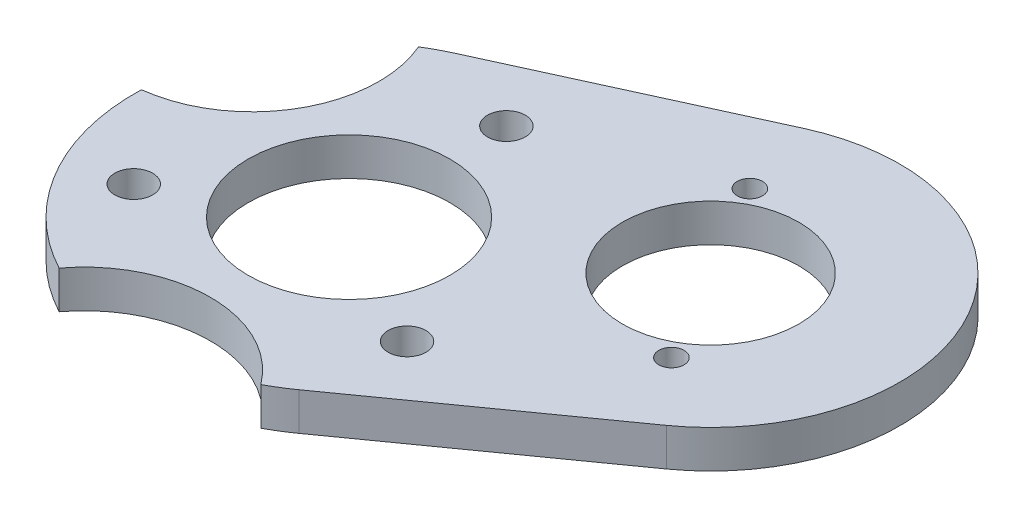
ISO-10303-21;
HEADER;
FILE_DESCRIPTION(('STEP AP214'),'2;1');
FILE_NAME('part.step','',(''),(''),'','','');
FILE_SCHEMA(('AUTOMOTIVE_DESIGN { 1 0 10303 214 1 1 1 1 }'));
ENDSEC;
DATA;
#1=APPLICATION_CONTEXT('core data for automotive mechanical design processes');
#2=APPLICATION_PROTOCOL_DEFINITION('international standard','automotive_design',2000,#1);
#3=PRODUCT_CONTEXT('',#1,'mechanical');
#4=PRODUCT('Part','Part','',(#3));
#5=PRODUCT_RELATED_PRODUCT_CATEGORY('part','',(#4));
#6=PRODUCT_DEFINITION_FORMATION('','',#4);
#7=PRODUCT_DEFINITION_CONTEXT('part definition',#1,'design');
#8=PRODUCT_DEFINITION('design','',#6,#7);
#9=PRODUCT_DEFINITION_SHAPE('','',#8);
#10=(LENGTH_UNIT() NAMED_UNIT(*) SI_UNIT(.MILLI.,.METRE.));
#11=(NAMED_UNIT(*) PLANE_ANGLE_UNIT() SI_UNIT($,.RADIAN.));
#12=(NAMED_UNIT(*) SI_UNIT($,.STERADIAN.) SOLID_ANGLE_UNIT());
#13=UNCERTAINTY_MEASURE_WITH_UNIT(LENGTH_MEASURE(1.E-05),#10,'distance_accuracy_value','');
#14=(GEOMETRIC_REPRESENTATION_CONTEXT(3) GLOBAL_UNCERTAINTY_ASSIGNED_CONTEXT((#13)) GLOBAL_UNIT_ASSIGNED_CONTEXT((#10,
#11,#12)) REPRESENTATION_CONTEXT('',''));
#15=CARTESIAN_POINT('',(0.,0.,0.));
#16=DIRECTION('',(0.,0.,1.));
#17=DIRECTION('',(1.,0.,0.));
#18=AXIS2_PLACEMENT_3D('',#15,#16,#17);
#19=CARTESIAN_POINT('',(0.,-80.,0.));
#20=DIRECTION('',(0.,1.,0.));
#21=DIRECTION('',(0.,0.,-1.));
#22=AXIS2_PLACEMENT_3D('',#19,#20,#21);
#23=CYLINDRICAL_SURFACE('',#22,17.);
#24=DIRECTION('',(0.,-1.,0.));
#25=VECTOR('',#24,1.);
#26=CARTESIAN_POINT('',(-7.05922706830702,-77.,-15.4650351825685));
#27=LINE('',#26,#25);
#28=CARTESIAN_POINT('',(-7.05922706830702,-77.,-15.4650351825685));
#29=VERTEX_POINT('',#28);
#30=CARTESIAN_POINT('',(-7.05922706830702,-80.,-15.4650351825685));
#31=VERTEX_POINT('',#30);
#32=EDGE_CURVE('E116',#29,#31,#27,.T.);
#33=ORIENTED_EDGE('',*,*,#32,.T.);
#34=CARTESIAN_POINT('',(0.,-80.,0.));
#35=DIRECTION('',(0.,-1.,0.));
#36=DIRECTION('',(0.,0.,1.));
#37=AXIS2_PLACEMENT_3D('',#34,#35,#36);
#38=CIRCLE('',#37,17.);
#39=CARTESIAN_POINT('',(-8.94741257322652,-80.,-14.454888731653));
#40=VERTEX_POINT('',#39);
#41=EDGE_CURVE('E172',#40,#31,#38,.T.);
#42=ORIENTED_EDGE('',*,*,#41,.F.);
#43=DIRECTION('',(0.,1.,0.));
#44=VECTOR('',#43,1.);
#45=CARTESIAN_POINT('',(-8.94741257322652,-80.,-14.454888731653));
#46=LINE('',#45,#44);
#47=CARTESIAN_POINT('',(-8.94741257322652,-77.,-14.454888731653));
#48=VERTEX_POINT('',#47);
#49=EDGE_CURVE('E43',#40,#48,#46,.T.);
#50=ORIENTED_EDGE('',*,*,#49,.T.);
#51=CARTESIAN_POINT('',(0.,-77.,0.));
#52=DIRECTION('',(0.,-1.,0.));
#53=DIRECTION('',(0.,0.,1.));
#54=AXIS2_PLACEMENT_3D('',#51,#52,#53);
#55=CIRCLE('',#54,17.);
#56=EDGE_CURVE('E182',#48,#29,#55,.T.);
#57=ORIENTED_EDGE('',*,*,#56,.T.);
#58=EDGE_LOOP('',(#33,#42,#50,#57));
#59=FACE_BOUND('',#58,.T.);
#60=ADVANCED_FACE('F34',(#59),#23,.T.);
#61=CARTESIAN_POINT('',(9.86349980437092,-80.,13.8459875635209));
#62=VERTEX_POINT('',#61);
#63=CARTESIAN_POINT('',(8.,-80.,15.));
#64=VERTEX_POINT('',#63);
#65=EDGE_CURVE('E171',#62,#64,#38,.T.);
#66=ORIENTED_EDGE('',*,*,#65,.F.);
#67=DIRECTION('',(0.,-1.,0.));
#68=VECTOR('',#67,1.);
#69=CARTESIAN_POINT('',(9.86349980437092,-77.,13.8459875635209));
#70=LINE('',#69,#68);
#71=CARTESIAN_POINT('',(9.86349980437092,-77.,13.8459875635209));
#72=VERTEX_POINT('',#71);
#73=EDGE_CURVE('E141',#72,#62,#70,.T.);
#74=ORIENTED_EDGE('',*,*,#73,.F.);
#75=CARTESIAN_POINT('',(8.,-77.,15.));
#76=VERTEX_POINT('',#75);
#77=EDGE_CURVE('E69',#72,#76,#55,.T.);
#78=ORIENTED_EDGE('',*,*,#77,.T.);
#79=DIRECTION('',(0.,1.,0.));
#80=VECTOR('',#79,1.);
#81=CARTESIAN_POINT('',(8.,-80.,15.));
#82=LINE('',#81,#80);
#83=EDGE_CURVE('E186',#64,#76,#82,.T.);
#84=ORIENTED_EDGE('',*,*,#83,.F.);
#85=EDGE_LOOP('',(#66,#74,#78,#84));
#86=FACE_BOUND('',#85,.T.);
#87=ADVANCED_FACE('F197',(#86),#23,.T.);
#88=CARTESIAN_POINT('',(-9.09326673973659,-80.,-5.25));
#89=DIRECTION('',(0.,-1.,0.));
#90=DIRECTION('',(0.,0.,1.));
#91=AXIS2_PLACEMENT_3D('',#88,#89,#90);
#92=PLANE('',#91);
#93=DIRECTION('',(0.814469856677698,0.,-0.580205870845348));
#94=VECTOR('',#93,1.);
#95=CARTESIAN_POINT('',(9.86349980437092,-80.,13.8459875635209));
#96=LINE('',#95,#94);
#97=CARTESIAN_POINT('',(26.8896215421534,-80.,1.71704785016547));
#98=VERTEX_POINT('',#97);
#99=EDGE_CURVE('E130',#62,#98,#96,.T.);
#100=ORIENTED_EDGE('',*,*,#99,.F.);
#101=ORIENTED_EDGE('',*,*,#65,.T.);
#102=CARTESIAN_POINT('',(0.,-80.,21.));
#103=DIRECTION('',(0.,1.,0.));
#104=DIRECTION('',(0.,0.,1.));
#105=AXIS2_PLACEMENT_3D('',#102,#103,#104);
#106=CIRCLE('',#105,10.);
#107=CARTESIAN_POINT('',(-8.,-80.,15.));
#108=VERTEX_POINT('',#107);
#109=EDGE_CURVE('E51',#64,#108,#106,.T.);
#110=ORIENTED_EDGE('',*,*,#109,.T.);
#111=CARTESIAN_POINT('',(0.,-80.,0.));
#112=DIRECTION('',(0.,-1.,0.));
#113=DIRECTION('',(0.,0.,1.));
#114=AXIS2_PLACEMENT_3D('',#111,#112,#113);
#115=CIRCLE('',#114,17.);
#116=CARTESIAN_POINT('',(-16.9920071371021,-80.,-0.521242220727994));
#117=VERTEX_POINT('',#116);
#118=EDGE_CURVE('E168',#108,#117,#115,.T.);
#119=ORIENTED_EDGE('',*,*,#118,.T.);
#120=CARTESIAN_POINT('',(-18.1865334794732,-80.,-10.5));
#121=DIRECTION('',(0.,1.,0.));
#122=DIRECTION('',(0.,0.,1.));
#123=AXIS2_PLACEMENT_3D('',#120,#121,#122);
#124=CIRCLE('',#123,10.05);
#125=EDGE_CURVE('E82',#117,#40,#124,.T.);
#126=ORIENTED_EDGE('',*,*,#125,.T.);
#127=ORIENTED_EDGE('',*,*,#41,.T.);
#128=DIRECTION('',(-0.909707951915794,0.,0.415248651076883));
#129=VECTOR('',#128,1.);
#130=CARTESIAN_POINT('',(-7.05922706830702,-80.,-15.4650351825685));
#131=LINE('',#130,#129);
#132=CARTESIAN_POINT('',(11.9578037133199,-80.,-24.1456192787369));
#133=VERTEX_POINT('',#132);
#134=EDGE_CURVE('E202',#133,#31,#131,.T.);
#135=ORIENTED_EDGE('',*,*,#134,.F.);
#136=CARTESIAN_POINT('',(18.1865334794732,-80.,-10.5));
#137=DIRECTION('',(0.,1.,0.));
#138=DIRECTION('',(0.,0.,-1.));
#139=AXIS2_PLACEMENT_3D('',#136,#137,#138);
#140=CIRCLE('',#139,15.);
#141=EDGE_CURVE('E134',#98,#133,#140,.T.);
#142=ORIENTED_EDGE('',*,*,#141,.F.);
#143=EDGE_LOOP('',(#100,#101,#110,#119,#126,#127,#135,#142));
#144=FACE_BOUND('',#143,.T.);
#145=CARTESIAN_POINT('',(10.8346034898601,-80.,6.23388861125312));
#146=DIRECTION('',(0.,-1.,0.));
#147=DIRECTION('',(0.,0.,1.));
#148=AXIS2_PLACEMENT_3D('',#145,#146,#147);
#149=CIRCLE('',#148,1.5);
#150=CARTESIAN_POINT('',(10.8346034898601,-80.,7.73388861125312));
#151=VERTEX_POINT('',#150);
#152=EDGE_CURVE('E148',#151,#151,#149,.T.);
#153=ORIENTED_EDGE('',*,*,#152,.F.);
#154=EDGE_LOOP('',(#153));
#155=FACE_BOUND('',#154,.T.);
#156=CARTESIAN_POINT('',(0.,-80.,0.));
#157=DIRECTION('',(0.,-1.,0.));
#158=DIRECTION('',(0.,0.,1.));
#159=AXIS2_PLACEMENT_3D('',#156,#157,#158);
#160=CIRCLE('',#159,8.);
#161=CARTESIAN_POINT('',(0.,-80.,8.));
#162=VERTEX_POINT('',#161);
#163=EDGE_CURVE('E162',#162,#162,#160,.T.);
#164=ORIENTED_EDGE('',*,*,#163,.F.);
#165=EDGE_LOOP('',(#164));
#166=FACE_BOUND('',#165,.T.);
#167=CARTESIAN_POINT('',(-10.8160076466377,-80.,6.26609755652382));
#168=DIRECTION('',(0.,-1.,0.));
#169=DIRECTION('',(0.,0.,1.));
#170=AXIS2_PLACEMENT_3D('',#167,#168,#169);
#171=CIRCLE('',#170,1.5);
#172=CARTESIAN_POINT('',(-10.8160076466377,-80.,7.76609755652382));
#173=VERTEX_POINT('',#172);
#174=EDGE_CURVE('E155',#173,#173,#171,.T.);
#175=ORIENTED_EDGE('',*,*,#174,.F.);
#176=EDGE_LOOP('',(#175));
#177=FACE_BOUND('',#176,.T.);
#178=CARTESIAN_POINT('',(-0.018595843222347,-80.,-12.4999861677769));
#179=DIRECTION('',(0.,-1.,0.));
#180=DIRECTION('',(0.,0.,1.));
#181=AXIS2_PLACEMENT_3D('',#178,#179,#180);
#182=CIRCLE('',#181,1.5);
#183=CARTESIAN_POINT('',(-0.0185958432223473,-80.,-10.9999861677769));
#184=VERTEX_POINT('',#183);
#185=EDGE_CURVE('E139',#184,#184,#182,.T.);
#186=ORIENTED_EDGE('',*,*,#185,.F.);
#187=EDGE_LOOP('',(#186));
#188=FACE_BOUND('',#187,.T.);
#189=CARTESIAN_POINT('',(13.9365334794732,-80.,-17.8612159321677));
#190=DIRECTION('',(0.,1.,0.));
#191=DIRECTION('',(0.,0.,-1.));
#192=AXIS2_PLACEMENT_3D('',#189,#190,#191);
#193=CIRCLE('',#192,1.);
#194=CARTESIAN_POINT('',(13.9365334794732,-80.,-16.8612159321677));
#195=VERTEX_POINT('',#194);
#196=EDGE_CURVE('E213',#195,#195,#193,.T.);
#197=ORIENTED_EDGE('',*,*,#196,.T.);
#198=EDGE_LOOP('',(#197));
#199=FACE_BOUND('',#198,.T.);
#200=CARTESIAN_POINT('',(22.4365334794732,-80.,-3.13878406783227));
#201=DIRECTION('',(0.,1.,0.));
#202=DIRECTION('',(0.,0.,-1.));
#203=AXIS2_PLACEMENT_3D('',#200,#201,#202);
#204=CIRCLE('',#203,1.);
#205=CARTESIAN_POINT('',(22.4365334794732,-80.,-2.13878406783227));
#206=VERTEX_POINT('',#205);
#207=EDGE_CURVE('E221',#206,#206,#204,.T.);
#208=ORIENTED_EDGE('',*,*,#207,.T.);
#209=EDGE_LOOP('',(#208));
#210=FACE_BOUND('',#209,.T.);
#211=CARTESIAN_POINT('',(18.1865334794732,-80.,-10.5));
#212=DIRECTION('',(0.,1.,0.));
#213=DIRECTION('',(0.,0.,-1.));
#214=AXIS2_PLACEMENT_3D('',#211,#212,#213);
#215=CIRCLE('',#214,7.);
#216=CARTESIAN_POINT('',(18.1865334794732,-80.,-3.5));
#217=VERTEX_POINT('',#216);
#218=EDGE_CURVE('E228',#217,#217,#215,.T.);
#219=ORIENTED_EDGE('',*,*,#218,.T.);
#220=EDGE_LOOP('',(#219));
#221=FACE_BOUND('',#220,.T.);
#222=ADVANCED_FACE('F199',(#144,#155,#166,#177,#188,#199,#210,#221),#92,.T.);
#223=CARTESIAN_POINT('',(-9.09326673973659,-77.,-5.25));
#224=DIRECTION('',(0.,-1.,0.));
#225=DIRECTION('',(0.,0.,1.));
#226=AXIS2_PLACEMENT_3D('',#223,#224,#225);
#227=PLANE('',#226);
#228=ORIENTED_EDGE('',*,*,#77,.F.);
#229=DIRECTION('',(0.814469856677698,0.,-0.580205870845348));
#230=VECTOR('',#229,1.);
#231=CARTESIAN_POINT('',(9.86349980437092,-77.,13.8459875635209));
#232=LINE('',#231,#230);
#233=CARTESIAN_POINT('',(26.8896215421534,-77.,1.71704785016547));
#234=VERTEX_POINT('',#233);
#235=EDGE_CURVE('E121',#72,#234,#232,.T.);
#236=ORIENTED_EDGE('',*,*,#235,.T.);
#237=CARTESIAN_POINT('',(18.1865334794732,-77.,-10.5));
#238=DIRECTION('',(0.,1.,0.));
#239=DIRECTION('',(0.,0.,-1.));
#240=AXIS2_PLACEMENT_3D('',#237,#238,#239);
#241=CIRCLE('',#240,15.);
#242=CARTESIAN_POINT('',(11.9578037133199,-77.,-24.1456192787369));
#243=VERTEX_POINT('',#242);
#244=EDGE_CURVE('E122',#234,#243,#241,.T.);
#245=ORIENTED_EDGE('',*,*,#244,.T.);
#246=DIRECTION('',(-0.909707951915794,0.,0.415248651076883));
#247=VECTOR('',#246,1.);
#248=CARTESIAN_POINT('',(-7.05922706830702,-77.,-15.4650351825685));
#249=LINE('',#248,#247);
#250=EDGE_CURVE('E109',#243,#29,#249,.T.);
#251=ORIENTED_EDGE('',*,*,#250,.T.);
#252=ORIENTED_EDGE('',*,*,#56,.F.);
#253=CARTESIAN_POINT('',(-18.1865334794732,-77.,-10.5));
#254=DIRECTION('',(0.,1.,0.));
#255=DIRECTION('',(0.,0.,1.));
#256=AXIS2_PLACEMENT_3D('',#253,#254,#255);
#257=CIRCLE('',#256,10.05);
#258=CARTESIAN_POINT('',(-16.9920071371021,-77.,-0.521242220727994));
#259=VERTEX_POINT('',#258);
#260=EDGE_CURVE('E180',#259,#48,#257,.T.);
#261=ORIENTED_EDGE('',*,*,#260,.F.);
#262=CARTESIAN_POINT('',(0.,-77.,0.));
#263=DIRECTION('',(0.,-1.,0.));
#264=DIRECTION('',(0.,0.,1.));
#265=AXIS2_PLACEMENT_3D('',#262,#263,#264);
#266=CIRCLE('',#265,17.);
#267=CARTESIAN_POINT('',(-8.,-77.,15.));
#268=VERTEX_POINT('',#267);
#269=EDGE_CURVE('E165',#268,#259,#266,.T.);
#270=ORIENTED_EDGE('',*,*,#269,.F.);
#271=CARTESIAN_POINT('',(0.,-77.,21.));
#272=DIRECTION('',(0.,1.,0.));
#273=DIRECTION('',(0.,0.,1.));
#274=AXIS2_PLACEMENT_3D('',#271,#272,#273);
#275=CIRCLE('',#274,10.);
#276=EDGE_CURVE('E75',#76,#268,#275,.T.);
#277=ORIENTED_EDGE('',*,*,#276,.F.);
#278=EDGE_LOOP('',(#228,#236,#245,#251,#252,#261,#270,#277));
#279=FACE_BOUND('',#278,.T.);
#280=CARTESIAN_POINT('',(0.,-77.,0.));
#281=DIRECTION('',(0.,-1.,0.));
#282=DIRECTION('',(0.,0.,1.));
#283=AXIS2_PLACEMENT_3D('',#280,#281,#282);
#284=CIRCLE('',#283,8.);
#285=CARTESIAN_POINT('',(0.,-77.,8.));
#286=VERTEX_POINT('',#285);
#287=EDGE_CURVE('E159',#286,#286,#284,.T.);
#288=ORIENTED_EDGE('',*,*,#287,.T.);
#289=EDGE_LOOP('',(#288));
#290=FACE_BOUND('',#289,.T.);
#291=CARTESIAN_POINT('',(-10.8160076466377,-77.,6.26609755652382));
#292=DIRECTION('',(0.,-1.,0.));
#293=DIRECTION('',(0.,0.,1.));
#294=AXIS2_PLACEMENT_3D('',#291,#292,#293);
#295=CIRCLE('',#294,1.5);
#296=CARTESIAN_POINT('',(-10.8160076466377,-77.,7.76609755652382));
#297=VERTEX_POINT('',#296);
#298=EDGE_CURVE('E152',#297,#297,#295,.T.);
#299=ORIENTED_EDGE('',*,*,#298,.T.);
#300=EDGE_LOOP('',(#299));
#301=FACE_BOUND('',#300,.T.);
#302=CARTESIAN_POINT('',(10.8346034898601,-77.,6.23388861125312));
#303=DIRECTION('',(0.,-1.,0.));
#304=DIRECTION('',(0.,0.,1.));
#305=AXIS2_PLACEMENT_3D('',#302,#303,#304);
#306=CIRCLE('',#305,1.5);
#307=CARTESIAN_POINT('',(10.8346034898601,-77.,7.73388861125312));
#308=VERTEX_POINT('',#307);
#309=EDGE_CURVE('E146',#308,#308,#306,.T.);
#310=ORIENTED_EDGE('',*,*,#309,.T.);
#311=EDGE_LOOP('',(#310));
#312=FACE_BOUND('',#311,.T.);
#313=CARTESIAN_POINT('',(-0.018595843222347,-77.,-12.4999861677769));
#314=DIRECTION('',(0.,-1.,0.));
#315=DIRECTION('',(0.,0.,1.));
#316=AXIS2_PLACEMENT_3D('',#313,#314,#315);
#317=CIRCLE('',#316,1.5);
#318=CARTESIAN_POINT('',(-0.0185958432223473,-77.,-10.9999861677769));
#319=VERTEX_POINT('',#318);
#320=EDGE_CURVE('E135',#319,#319,#317,.T.);
#321=ORIENTED_EDGE('',*,*,#320,.T.);
#322=EDGE_LOOP('',(#321));
#323=FACE_BOUND('',#322,.T.);
#324=CARTESIAN_POINT('',(22.4365334794732,-77.,-3.13878406783227));
#325=DIRECTION('',(0.,1.,0.));
#326=DIRECTION('',(0.,0.,-1.));
#327=AXIS2_PLACEMENT_3D('',#324,#325,#326);
#328=CIRCLE('',#327,1.);
#329=CARTESIAN_POINT('',(22.4365334794732,-77.,-2.13878406783227));
#330=VERTEX_POINT('',#329);
#331=EDGE_CURVE('E218',#330,#330,#328,.T.);
#332=ORIENTED_EDGE('',*,*,#331,.F.);
#333=EDGE_LOOP('',(#332));
#334=FACE_BOUND('',#333,.T.);
#335=CARTESIAN_POINT('',(13.9365334794732,-77.,-17.8612159321677));
#336=DIRECTION('',(0.,1.,0.));
#337=DIRECTION('',(0.,0.,-1.));
#338=AXIS2_PLACEMENT_3D('',#335,#336,#337);
#339=CIRCLE('',#338,1.);
#340=CARTESIAN_POINT('',(13.9365334794732,-77.,-16.8612159321677));
#341=VERTEX_POINT('',#340);
#342=EDGE_CURVE('E211',#341,#341,#339,.T.);
#343=ORIENTED_EDGE('',*,*,#342,.F.);
#344=EDGE_LOOP('',(#343));
#345=FACE_BOUND('',#344,.T.);
#346=CARTESIAN_POINT('',(18.1865334794732,-77.,-10.5));
#347=DIRECTION('',(0.,1.,0.));
#348=DIRECTION('',(0.,0.,-1.));
#349=AXIS2_PLACEMENT_3D('',#346,#347,#348);
#350=CIRCLE('',#349,7.);
#351=CARTESIAN_POINT('',(18.1865334794732,-77.,-3.5));
#352=VERTEX_POINT('',#351);
#353=EDGE_CURVE('E225',#352,#352,#350,.T.);
#354=ORIENTED_EDGE('',*,*,#353,.F.);
#355=EDGE_LOOP('',(#354));
#356=FACE_BOUND('',#355,.T.);
#357=ADVANCED_FACE('F125',(#279,#290,#301,#312,#323,#334,#345,#356),#227,.F.);
#358=CARTESIAN_POINT('',(0.,-80.,0.));
#359=DIRECTION('',(0.,1.,0.));
#360=DIRECTION('',(0.,0.,-1.));
#361=AXIS2_PLACEMENT_3D('',#358,#359,#360);
#362=CYLINDRICAL_SURFACE('',#361,17.);
#363=ORIENTED_EDGE('',*,*,#269,.T.);
#364=DIRECTION('',(0.,1.,0.));
#365=VECTOR('',#364,1.);
#366=CARTESIAN_POINT('',(-16.9920071371021,-80.,-0.521242220727994));
#367=LINE('',#366,#365);
#368=EDGE_CURVE('E11',#117,#259,#367,.T.);
#369=ORIENTED_EDGE('',*,*,#368,.F.);
#370=ORIENTED_EDGE('',*,*,#118,.F.);
#371=DIRECTION('',(0.,1.,0.));
#372=VECTOR('',#371,1.);
#373=CARTESIAN_POINT('',(-8.,-80.,15.));
#374=LINE('',#373,#372);
#375=EDGE_CURVE('E176',#108,#268,#374,.T.);
#376=ORIENTED_EDGE('',*,*,#375,.T.);
#377=EDGE_LOOP('',(#363,#369,#370,#376));
#378=FACE_BOUND('',#377,.T.);
#379=ADVANCED_FACE('F36',(#378),#362,.T.);
#380=CARTESIAN_POINT('',(-18.1865334794732,-80.,-10.5));
#381=DIRECTION('',(0.,1.,0.));
#382=DIRECTION('',(0.,0.,-1.));
#383=AXIS2_PLACEMENT_3D('',#380,#381,#382);
#384=CYLINDRICAL_SURFACE('',#383,10.05);
#385=ORIENTED_EDGE('',*,*,#260,.T.);
#386=ORIENTED_EDGE('',*,*,#49,.F.);
#387=ORIENTED_EDGE('',*,*,#125,.F.);
#388=ORIENTED_EDGE('',*,*,#368,.T.);
#389=EDGE_LOOP('',(#385,#386,#387,#388));
#390=FACE_BOUND('',#389,.T.);
#391=ADVANCED_FACE('F192',(#390),#384,.F.);
#392=CARTESIAN_POINT('',(0.,-80.,21.));
#393=DIRECTION('',(0.,1.,0.));
#394=DIRECTION('',(0.,0.,-1.));
#395=AXIS2_PLACEMENT_3D('',#392,#393,#394);
#396=CYLINDRICAL_SURFACE('',#395,10.);
#397=ORIENTED_EDGE('',*,*,#276,.T.);
#398=ORIENTED_EDGE('',*,*,#375,.F.);
#399=ORIENTED_EDGE('',*,*,#109,.F.);
#400=ORIENTED_EDGE('',*,*,#83,.T.);
#401=EDGE_LOOP('',(#397,#398,#399,#400));
#402=FACE_BOUND('',#401,.T.);
#403=ADVANCED_FACE('F195',(#402),#396,.F.);
#404=CARTESIAN_POINT('',(0.,-80.,0.));
#405=DIRECTION('',(0.,1.,0.));
#406=DIRECTION('',(0.,0.,-1.));
#407=AXIS2_PLACEMENT_3D('',#404,#405,#406);
#408=CYLINDRICAL_SURFACE('',#407,8.);
#409=ORIENTED_EDGE('',*,*,#163,.T.);
#410=EDGE_LOOP('',(#409));
#411=FACE_BOUND('',#410,.T.);
#412=ORIENTED_EDGE('',*,*,#287,.F.);
#413=EDGE_LOOP('',(#412));
#414=FACE_BOUND('',#413,.T.);
#415=ADVANCED_FACE('F258',(#411,#414),#408,.F.);
#416=CARTESIAN_POINT('',(-10.8160076466377,-80.,6.26609755652382));
#417=DIRECTION('',(0.,1.,0.));
#418=DIRECTION('',(0.,0.,-1.));
#419=AXIS2_PLACEMENT_3D('',#416,#417,#418);
#420=CYLINDRICAL_SURFACE('',#419,1.5);
#421=ORIENTED_EDGE('',*,*,#174,.T.);
#422=EDGE_LOOP('',(#421));
#423=FACE_BOUND('',#422,.T.);
#424=ORIENTED_EDGE('',*,*,#298,.F.);
#425=EDGE_LOOP('',(#424));
#426=FACE_BOUND('',#425,.T.);
#427=ADVANCED_FACE('F263',(#423,#426),#420,.F.);
#428=CARTESIAN_POINT('',(10.8346034898601,-80.,6.23388861125312));
#429=DIRECTION('',(0.,1.,0.));
#430=DIRECTION('',(0.,0.,-1.));
#431=AXIS2_PLACEMENT_3D('',#428,#429,#430);
#432=CYLINDRICAL_SURFACE('',#431,1.5);
#433=ORIENTED_EDGE('',*,*,#152,.T.);
#434=EDGE_LOOP('',(#433));
#435=FACE_BOUND('',#434,.T.);
#436=ORIENTED_EDGE('',*,*,#309,.F.);
#437=EDGE_LOOP('',(#436));
#438=FACE_BOUND('',#437,.T.);
#439=ADVANCED_FACE('F270',(#435,#438),#432,.F.);
#440=CARTESIAN_POINT('',(-0.018595843222347,-80.,-12.4999861677769));
#441=DIRECTION('',(0.,1.,0.));
#442=DIRECTION('',(0.,0.,-1.));
#443=AXIS2_PLACEMENT_3D('',#440,#441,#442);
#444=CYLINDRICAL_SURFACE('',#443,1.5);
#445=ORIENTED_EDGE('',*,*,#185,.T.);
#446=EDGE_LOOP('',(#445));
#447=FACE_BOUND('',#446,.T.);
#448=ORIENTED_EDGE('',*,*,#320,.F.);
#449=EDGE_LOOP('',(#448));
#450=FACE_BOUND('',#449,.T.);
#451=ADVANCED_FACE('F277',(#447,#450),#444,.F.);
#452=CARTESIAN_POINT('',(18.1865334794732,-77.,-10.5));
#453=DIRECTION('',(0.,-1.,0.));
#454=DIRECTION('',(0.,0.,1.));
#455=AXIS2_PLACEMENT_3D('',#452,#453,#454);
#456=CYLINDRICAL_SURFACE('',#455,15.);
#457=ORIENTED_EDGE('',*,*,#141,.T.);
#458=DIRECTION('',(0.,-1.,0.));
#459=VECTOR('',#458,1.);
#460=CARTESIAN_POINT('',(11.9578037133199,-77.,-24.1456192787369));
#461=LINE('',#460,#459);
#462=EDGE_CURVE('E113',#243,#133,#461,.T.);
#463=ORIENTED_EDGE('',*,*,#462,.F.);
#464=ORIENTED_EDGE('',*,*,#244,.F.);
#465=DIRECTION('',(0.,-1.,0.));
#466=VECTOR('',#465,1.);
#467=CARTESIAN_POINT('',(26.8896215421534,-77.,1.71704785016547));
#468=LINE('',#467,#466);
#469=EDGE_CURVE('E207',#234,#98,#468,.T.);
#470=ORIENTED_EDGE('',*,*,#469,.T.);
#471=EDGE_LOOP('',(#457,#463,#464,#470));
#472=FACE_BOUND('',#471,.T.);
#473=ADVANCED_FACE('F132',(#472),#456,.T.);
#474=CARTESIAN_POINT('',(-7.05922706830702,-77.,-15.4650351825685));
#475=DIRECTION('',(0.415248651076883,0.,0.909707951915794));
#476=DIRECTION('',(0.909707951915794,0.,-0.415248651076883));
#477=AXIS2_PLACEMENT_3D('',#474,#475,#476);
#478=PLANE('',#477);
#479=ORIENTED_EDGE('',*,*,#134,.T.);
#480=ORIENTED_EDGE('',*,*,#32,.F.);
#481=ORIENTED_EDGE('',*,*,#250,.F.);
#482=ORIENTED_EDGE('',*,*,#462,.T.);
#483=EDGE_LOOP('',(#479,#480,#481,#482));
#484=FACE_BOUND('',#483,.T.);
#485=ADVANCED_FACE('F111',(#484),#478,.F.);
#486=CARTESIAN_POINT('',(9.86349980437092,-77.,13.8459875635209));
#487=DIRECTION('',(-0.580205870845349,0.,-0.814469856677698));
#488=DIRECTION('',(-0.814469856677698,0.,0.580205870845349));
#489=AXIS2_PLACEMENT_3D('',#486,#487,#488);
#490=PLANE('',#489);
#491=ORIENTED_EDGE('',*,*,#99,.T.);
#492=ORIENTED_EDGE('',*,*,#469,.F.);
#493=ORIENTED_EDGE('',*,*,#235,.F.);
#494=ORIENTED_EDGE('',*,*,#73,.T.);
#495=EDGE_LOOP('',(#491,#492,#493,#494));
#496=FACE_BOUND('',#495,.T.);
#497=ADVANCED_FACE('F209',(#496),#490,.F.);
#498=CARTESIAN_POINT('',(13.9365334794732,-77.,-17.8612159321677));
#499=DIRECTION('',(0.,-1.,0.));
#500=DIRECTION('',(0.,0.,1.));
#501=AXIS2_PLACEMENT_3D('',#498,#499,#500);
#502=CYLINDRICAL_SURFACE('',#501,1.);
#503=CARTESIAN_POINT('',(13.9365334794732,-77.,-16.8612159321677));
#504=CARTESIAN_POINT('',(13.9365334794732,-77.03125,-16.8612159321677));
#505=CARTESIAN_POINT('',(13.9365334794732,-77.0625,-16.8612159321677));
#506=CARTESIAN_POINT('',(13.9365334794732,-77.125,-16.8612159321677));
#507=CARTESIAN_POINT('',(13.9365334794732,-77.15625,-16.8612159321677));
#508=CARTESIAN_POINT('',(13.9365334794732,-77.21875,-16.8612159321677));
#509=CARTESIAN_POINT('',(13.9365334794732,-77.25,-16.8612159321677));
#510=CARTESIAN_POINT('',(13.9365334794732,-77.3125,-16.8612159321677));
#511=CARTESIAN_POINT('',(13.9365334794732,-77.34375,-16.8612159321677));
#512=CARTESIAN_POINT('',(13.9365334794732,-77.40625,-16.8612159321677));
#513=CARTESIAN_POINT('',(13.9365334794732,-77.4375,-16.8612159321677));
#514=CARTESIAN_POINT('',(13.9365334794732,-77.5,-16.8612159321677));
#515=CARTESIAN_POINT('',(13.9365334794732,-77.53125,-16.8612159321677));
#516=CARTESIAN_POINT('',(13.9365334794732,-77.59375,-16.8612159321677));
#517=CARTESIAN_POINT('',(13.9365334794732,-77.625,-16.8612159321677));
#518=CARTESIAN_POINT('',(13.9365334794732,-77.6875,-16.8612159321677));
#519=CARTESIAN_POINT('',(13.9365334794732,-77.71875,-16.8612159321677));
#520=CARTESIAN_POINT('',(13.9365334794732,-77.78125,-16.8612159321677));
#521=CARTESIAN_POINT('',(13.9365334794732,-77.8125,-16.8612159321677));
#522=CARTESIAN_POINT('',(13.9365334794732,-77.875,-16.8612159321677));
#523=CARTESIAN_POINT('',(13.9365334794732,-77.90625,-16.8612159321677));
#524=CARTESIAN_POINT('',(13.9365334794732,-77.96875,-16.8612159321677));
#525=CARTESIAN_POINT('',(13.9365334794732,-78.,-16.8612159321677));
#526=CARTESIAN_POINT('',(13.9365334794732,-78.0625,-16.8612159321677));
#527=CARTESIAN_POINT('',(13.9365334794732,-78.09375,-16.8612159321677));
#528=CARTESIAN_POINT('',(13.9365334794732,-78.15625,-16.8612159321677));
#529=CARTESIAN_POINT('',(13.9365334794732,-78.1875,-16.8612159321677));
#530=CARTESIAN_POINT('',(13.9365334794732,-78.25,-16.8612159321677));
#531=CARTESIAN_POINT('',(13.9365334794732,-78.28125,-16.8612159321677));
#532=CARTESIAN_POINT('',(13.9365334794732,-78.34375,-16.8612159321677));
#533=CARTESIAN_POINT('',(13.9365334794732,-78.375,-16.8612159321677));
#534=CARTESIAN_POINT('',(13.9365334794732,-78.4375,-16.8612159321677));
#535=CARTESIAN_POINT('',(13.9365334794732,-78.46875,-16.8612159321677));
#536=CARTESIAN_POINT('',(13.9365334794732,-78.53125,-16.8612159321677));
#537=CARTESIAN_POINT('',(13.9365334794732,-78.5625,-16.8612159321677));
#538=CARTESIAN_POINT('',(13.9365334794732,-78.625,-16.8612159321677));
#539=CARTESIAN_POINT('',(13.9365334794732,-78.65625,-16.8612159321677));
#540=CARTESIAN_POINT('',(13.9365334794732,-78.71875,-16.8612159321677));
#541=CARTESIAN_POINT('',(13.9365334794732,-78.75,-16.8612159321677));
#542=CARTESIAN_POINT('',(13.9365334794732,-78.8125,-16.8612159321677));
#543=CARTESIAN_POINT('',(13.9365334794732,-78.84375,-16.8612159321677));
#544=CARTESIAN_POINT('',(13.9365334794732,-78.90625,-16.8612159321677));
#545=CARTESIAN_POINT('',(13.9365334794732,-78.9375,-16.8612159321677));
#546=CARTESIAN_POINT('',(13.9365334794732,-79.,-16.8612159321677));
#547=CARTESIAN_POINT('',(13.9365334794732,-79.03125,-16.8612159321677));
#548=CARTESIAN_POINT('',(13.9365334794732,-79.09375,-16.8612159321677));
#549=CARTESIAN_POINT('',(13.9365334794732,-79.125,-16.8612159321677));
#550=CARTESIAN_POINT('',(13.9365334794732,-79.1875,-16.8612159321677));
#551=CARTESIAN_POINT('',(13.9365334794732,-79.21875,-16.8612159321677));
#552=CARTESIAN_POINT('',(13.9365334794732,-79.28125,-16.8612159321677));
#553=CARTESIAN_POINT('',(13.9365334794732,-79.3125,-16.8612159321677));
#554=CARTESIAN_POINT('',(13.9365334794732,-79.375,-16.8612159321677));
#555=CARTESIAN_POINT('',(13.9365334794732,-79.40625,-16.8612159321677));
#556=CARTESIAN_POINT('',(13.9365334794732,-79.46875,-16.8612159321677));
#557=CARTESIAN_POINT('',(13.9365334794732,-79.5,-16.8612159321677));
#558=CARTESIAN_POINT('',(13.9365334794732,-79.5625,-16.8612159321677));
#559=CARTESIAN_POINT('',(13.9365334794732,-79.59375,-16.8612159321677));
#560=CARTESIAN_POINT('',(13.9365334794732,-79.65625,-16.8612159321677));
#561=CARTESIAN_POINT('',(13.9365334794732,-79.6875,-16.8612159321677));
#562=CARTESIAN_POINT('',(13.9365334794732,-79.75,-16.8612159321677));
#563=CARTESIAN_POINT('',(13.9365334794732,-79.78125,-16.8612159321677));
#564=CARTESIAN_POINT('',(13.9365334794732,-79.84375,-16.8612159321677));
#565=CARTESIAN_POINT('',(13.9365334794732,-79.875,-16.8612159321677));
#566=CARTESIAN_POINT('',(13.9365334794732,-79.9375,-16.8612159321677));
#567=CARTESIAN_POINT('',(13.9365334794732,-79.96875,-16.8612159321677));
#568=CARTESIAN_POINT('',(13.9365334794732,-80.,-16.8612159321677));
#569=B_SPLINE_CURVE_WITH_KNOTS('',3,(#503,#504,#505,#506,#507,#508,#509,#510,#511,#512,#513,
#514,#515,#516,#517,#518,#519,#520,#521,#522,#523,#524,#525,#526,#527,#528,#529,#530,#531,#532,
#533,#534,#535,#536,#537,#538,#539,#540,#541,#542,#543,#544,#545,#546,#547,#548,#549,#550,#551,
#552,#553,#554,#555,#556,#557,#558,#559,#560,#561,#562,#563,#564,#565,#566,#567,#568),
.UNSPECIFIED.,.F.,.F.,(4,2,2,2,2,2,2,2,2,2,2,2,2,2,2,2,2,2,2,2,2,2,2,2,2,2,2,2,2,2,2,2,4),(0.,
0.0937499999999897,0.187499999999993,0.281249999999997,0.375,0.46874999999999,0.562499999999994,
0.656249999999997,0.750000000000001,0.84374999999999,0.937499999999994,1.03125,1.125,
1.21874999999999,1.31249999999999,1.40625,1.5,1.59374999999999,1.68749999999999,1.78125,1.875,
1.96874999999999,2.06249999999999,2.15625,2.25,2.34374999999999,2.4375,2.53125,2.625,
2.71874999999999,2.8125,2.90625,3.),.UNSPECIFIED.);
#570=EDGE_CURVE('BSEAM288',#341,#195,#569,.T.);
#571=ORIENTED_EDGE('',*,*,#342,.T.);
#572=ORIENTED_EDGE('',*,*,#196,.F.);
#573=ORIENTED_EDGE('',*,*,#570,.T.);
#574=ORIENTED_EDGE('',*,*,#570,.F.);
#575=EDGE_LOOP('',(#571,#573,#572,#574));
#576=FACE_BOUND('',#575,.T.);
#577=ADVANCED_FACE('F288',(#576),#502,.F.);
#578=CARTESIAN_POINT('',(22.4365334794732,-77.,-3.13878406783227));
#579=DIRECTION('',(0.,-1.,0.));
#580=DIRECTION('',(0.,0.,1.));
#581=AXIS2_PLACEMENT_3D('',#578,#579,#580);
#582=CYLINDRICAL_SURFACE('',#581,1.);
#583=CARTESIAN_POINT('',(22.4365334794732,-77.,-2.13878406783227));
#584=CARTESIAN_POINT('',(22.4365334794732,-77.03125,-2.13878406783227));
#585=CARTESIAN_POINT('',(22.4365334794732,-77.0625,-2.13878406783227));
#586=CARTESIAN_POINT('',(22.4365334794732,-77.125,-2.13878406783227));
#587=CARTESIAN_POINT('',(22.4365334794732,-77.15625,-2.13878406783227));
#588=CARTESIAN_POINT('',(22.4365334794732,-77.21875,-2.13878406783227));
#589=CARTESIAN_POINT('',(22.4365334794732,-77.25,-2.13878406783227));
#590=CARTESIAN_POINT('',(22.4365334794732,-77.3125,-2.13878406783227));
#591=CARTESIAN_POINT('',(22.4365334794732,-77.34375,-2.13878406783227));
#592=CARTESIAN_POINT('',(22.4365334794732,-77.40625,-2.13878406783227));
#593=CARTESIAN_POINT('',(22.4365334794732,-77.4375,-2.13878406783227));
#594=CARTESIAN_POINT('',(22.4365334794732,-77.5,-2.13878406783227));
#595=CARTESIAN_POINT('',(22.4365334794732,-77.53125,-2.13878406783227));
#596=CARTESIAN_POINT('',(22.4365334794732,-77.59375,-2.13878406783227));
#597=CARTESIAN_POINT('',(22.4365334794732,-77.625,-2.13878406783227));
#598=CARTESIAN_POINT('',(22.4365334794732,-77.6875,-2.13878406783227));
#599=CARTESIAN_POINT('',(22.4365334794732,-77.71875,-2.13878406783227));
#600=CARTESIAN_POINT('',(22.4365334794732,-77.78125,-2.13878406783227));
#601=CARTESIAN_POINT('',(22.4365334794732,-77.8125,-2.13878406783227));
#602=CARTESIAN_POINT('',(22.4365334794732,-77.875,-2.13878406783227));
#603=CARTESIAN_POINT('',(22.4365334794732,-77.90625,-2.13878406783227));
#604=CARTESIAN_POINT('',(22.4365334794732,-77.96875,-2.13878406783227));
#605=CARTESIAN_POINT('',(22.4365334794732,-78.,-2.13878406783227));
#606=CARTESIAN_POINT('',(22.4365334794732,-78.0625,-2.13878406783227));
#607=CARTESIAN_POINT('',(22.4365334794732,-78.09375,-2.13878406783227));
#608=CARTESIAN_POINT('',(22.4365334794732,-78.15625,-2.13878406783227));
#609=CARTESIAN_POINT('',(22.4365334794732,-78.1875,-2.13878406783227));
#610=CARTESIAN_POINT('',(22.4365334794732,-78.25,-2.13878406783227));
#611=CARTESIAN_POINT('',(22.4365334794732,-78.28125,-2.13878406783227));
#612=CARTESIAN_POINT('',(22.4365334794732,-78.34375,-2.13878406783227));
#613=CARTESIAN_POINT('',(22.4365334794732,-78.375,-2.13878406783227));
#614=CARTESIAN_POINT('',(22.4365334794732,-78.4375,-2.13878406783227));
#615=CARTESIAN_POINT('',(22.4365334794732,-78.46875,-2.13878406783227));
#616=CARTESIAN_POINT('',(22.4365334794732,-78.53125,-2.13878406783227));
#617=CARTESIAN_POINT('',(22.4365334794732,-78.5625,-2.13878406783227));
#618=CARTESIAN_POINT('',(22.4365334794732,-78.625,-2.13878406783227));
#619=CARTESIAN_POINT('',(22.4365334794732,-78.65625,-2.13878406783227));
#620=CARTESIAN_POINT('',(22.4365334794732,-78.71875,-2.13878406783227));
#621=CARTESIAN_POINT('',(22.4365334794732,-78.75,-2.13878406783227));
#622=CARTESIAN_POINT('',(22.4365334794732,-78.8125,-2.13878406783227));
#623=CARTESIAN_POINT('',(22.4365334794732,-78.84375,-2.13878406783227));
#624=CARTESIAN_POINT('',(22.4365334794732,-78.90625,-2.13878406783227));
#625=CARTESIAN_POINT('',(22.4365334794732,-78.9375,-2.13878406783227));
#626=CARTESIAN_POINT('',(22.4365334794732,-79.,-2.13878406783227));
#627=CARTESIAN_POINT('',(22.4365334794732,-79.03125,-2.13878406783227));
#628=CARTESIAN_POINT('',(22.4365334794732,-79.09375,-2.13878406783227));
#629=CARTESIAN_POINT('',(22.4365334794732,-79.125,-2.13878406783227));
#630=CARTESIAN_POINT('',(22.4365334794732,-79.1875,-2.13878406783227));
#631=CARTESIAN_POINT('',(22.4365334794732,-79.21875,-2.13878406783227));
#632=CARTESIAN_POINT('',(22.4365334794732,-79.28125,-2.13878406783227));
#633=CARTESIAN_POINT('',(22.4365334794732,-79.3125,-2.13878406783227));
#634=CARTESIAN_POINT('',(22.4365334794732,-79.375,-2.13878406783227));
#635=CARTESIAN_POINT('',(22.4365334794732,-79.40625,-2.13878406783227));
#636=CARTESIAN_POINT('',(22.4365334794732,-79.46875,-2.13878406783227));
#637=CARTESIAN_POINT('',(22.4365334794732,-79.5,-2.13878406783227));
#638=CARTESIAN_POINT('',(22.4365334794732,-79.5625,-2.13878406783227));
#639=CARTESIAN_POINT('',(22.4365334794732,-79.59375,-2.13878406783227));
#640=CARTESIAN_POINT('',(22.4365334794732,-79.65625,-2.13878406783227));
#641=CARTESIAN_POINT('',(22.4365334794732,-79.6875,-2.13878406783227));
#642=CARTESIAN_POINT('',(22.4365334794732,-79.75,-2.13878406783227));
#643=CARTESIAN_POINT('',(22.4365334794732,-79.78125,-2.13878406783227));
#644=CARTESIAN_POINT('',(22.4365334794732,-79.84375,-2.13878406783227));
#645=CARTESIAN_POINT('',(22.4365334794732,-79.875,-2.13878406783227));
#646=CARTESIAN_POINT('',(22.4365334794732,-79.9375,-2.13878406783227));
#647=CARTESIAN_POINT('',(22.4365334794732,-79.96875,-2.13878406783227));
#648=CARTESIAN_POINT('',(22.4365334794732,-80.,-2.13878406783227));
#649=B_SPLINE_CURVE_WITH_KNOTS('',3,(#583,#584,#585,#586,#587,#588,#589,#590,#591,#592,#593,
#594,#595,#596,#597,#598,#599,#600,#601,#602,#603,#604,#605,#606,#607,#608,#609,#610,#611,#612,
#613,#614,#615,#616,#617,#618,#619,#620,#621,#622,#623,#624,#625,#626,#627,#628,#629,#630,#631,
#632,#633,#634,#635,#636,#637,#638,#639,#640,#641,#642,#643,#644,#645,#646,#647,#648),
.UNSPECIFIED.,.F.,.F.,(4,2,2,2,2,2,2,2,2,2,2,2,2,2,2,2,2,2,2,2,2,2,2,2,2,2,2,2,2,2,2,2,4),(0.,
0.0937499999999897,0.187499999999993,0.281249999999997,0.375,0.46874999999999,0.562499999999994,
0.656249999999997,0.750000000000001,0.84374999999999,0.937499999999994,1.03125,1.125,
1.21874999999999,1.31249999999999,1.40625,1.5,1.59374999999999,1.68749999999999,1.78125,1.875,
1.96874999999999,2.06249999999999,2.15625,2.25,2.34374999999999,2.4375,2.53125,2.625,
2.71874999999999,2.8125,2.90625,3.),.UNSPECIFIED.);
#650=EDGE_CURVE('BSEAM291',#330,#206,#649,.T.);
#651=ORIENTED_EDGE('',*,*,#331,.T.);
#652=ORIENTED_EDGE('',*,*,#207,.F.);
#653=ORIENTED_EDGE('',*,*,#650,.T.);
#654=ORIENTED_EDGE('',*,*,#650,.F.);
#655=EDGE_LOOP('',(#651,#653,#652,#654));
#656=FACE_BOUND('',#655,.T.);
#657=ADVANCED_FACE('F291',(#656),#582,.F.);
#658=CARTESIAN_POINT('',(18.1865334794732,-77.,-10.5));
#659=DIRECTION('',(0.,-1.,0.));
#660=DIRECTION('',(0.,0.,1.));
#661=AXIS2_PLACEMENT_3D('',#658,#659,#660);
#662=CYLINDRICAL_SURFACE('',#661,7.);
#663=CARTESIAN_POINT('',(18.1865334794732,-77.,-3.5));
#664=CARTESIAN_POINT('',(18.1865334794732,-77.03125,-3.5));
#665=CARTESIAN_POINT('',(18.1865334794732,-77.0625,-3.5));
#666=CARTESIAN_POINT('',(18.1865334794732,-77.125,-3.5));
#667=CARTESIAN_POINT('',(18.1865334794732,-77.15625,-3.5));
#668=CARTESIAN_POINT('',(18.1865334794732,-77.21875,-3.5));
#669=CARTESIAN_POINT('',(18.1865334794732,-77.25,-3.5));
#670=CARTESIAN_POINT('',(18.1865334794732,-77.3125,-3.5));
#671=CARTESIAN_POINT('',(18.1865334794732,-77.34375,-3.5));
#672=CARTESIAN_POINT('',(18.1865334794732,-77.40625,-3.5));
#673=CARTESIAN_POINT('',(18.1865334794732,-77.4375,-3.5));
#674=CARTESIAN_POINT('',(18.1865334794732,-77.5,-3.5));
#675=CARTESIAN_POINT('',(18.1865334794732,-77.53125,-3.5));
#676=CARTESIAN_POINT('',(18.1865334794732,-77.59375,-3.5));
#677=CARTESIAN_POINT('',(18.1865334794732,-77.625,-3.5));
#678=CARTESIAN_POINT('',(18.1865334794732,-77.6875,-3.5));
#679=CARTESIAN_POINT('',(18.1865334794732,-77.71875,-3.5));
#680=CARTESIAN_POINT('',(18.1865334794732,-77.78125,-3.5));
#681=CARTESIAN_POINT('',(18.1865334794732,-77.8125,-3.5));
#682=CARTESIAN_POINT('',(18.1865334794732,-77.875,-3.5));
#683=CARTESIAN_POINT('',(18.1865334794732,-77.90625,-3.5));
#684=CARTESIAN_POINT('',(18.1865334794732,-77.96875,-3.5));
#685=CARTESIAN_POINT('',(18.1865334794732,-78.,-3.5));
#686=CARTESIAN_POINT('',(18.1865334794732,-78.0625,-3.5));
#687=CARTESIAN_POINT('',(18.1865334794732,-78.09375,-3.5));
#688=CARTESIAN_POINT('',(18.1865334794732,-78.15625,-3.5));
#689=CARTESIAN_POINT('',(18.1865334794732,-78.1875,-3.5));
#690=CARTESIAN_POINT('',(18.1865334794732,-78.25,-3.5));
#691=CARTESIAN_POINT('',(18.1865334794732,-78.28125,-3.5));
#692=CARTESIAN_POINT('',(18.1865334794732,-78.34375,-3.5));
#693=CARTESIAN_POINT('',(18.1865334794732,-78.375,-3.5));
#694=CARTESIAN_POINT('',(18.1865334794732,-78.4375,-3.5));
#695=CARTESIAN_POINT('',(18.1865334794732,-78.46875,-3.5));
#696=CARTESIAN_POINT('',(18.1865334794732,-78.53125,-3.5));
#697=CARTESIAN_POINT('',(18.1865334794732,-78.5625,-3.5));
#698=CARTESIAN_POINT('',(18.1865334794732,-78.625,-3.5));
#699=CARTESIAN_POINT('',(18.1865334794732,-78.65625,-3.5));
#700=CARTESIAN_POINT('',(18.1865334794732,-78.71875,-3.5));
#701=CARTESIAN_POINT('',(18.1865334794732,-78.75,-3.5));
#702=CARTESIAN_POINT('',(18.1865334794732,-78.8125,-3.5));
#703=CARTESIAN_POINT('',(18.1865334794732,-78.84375,-3.5));
#704=CARTESIAN_POINT('',(18.1865334794732,-78.90625,-3.5));
#705=CARTESIAN_POINT('',(18.1865334794732,-78.9375,-3.5));
#706=CARTESIAN_POINT('',(18.1865334794732,-79.,-3.5));
#707=CARTESIAN_POINT('',(18.1865334794732,-79.03125,-3.5));
#708=CARTESIAN_POINT('',(18.1865334794732,-79.09375,-3.5));
#709=CARTESIAN_POINT('',(18.1865334794732,-79.125,-3.5));
#710=CARTESIAN_POINT('',(18.1865334794732,-79.1875,-3.5));
#711=CARTESIAN_POINT('',(18.1865334794732,-79.21875,-3.5));
#712=CARTESIAN_POINT('',(18.1865334794732,-79.28125,-3.5));
#713=CARTESIAN_POINT('',(18.1865334794732,-79.3125,-3.5));
#714=CARTESIAN_POINT('',(18.1865334794732,-79.375,-3.5));
#715=CARTESIAN_POINT('',(18.1865334794732,-79.40625,-3.5));
#716=CARTESIAN_POINT('',(18.1865334794732,-79.46875,-3.5));
#717=CARTESIAN_POINT('',(18.1865334794732,-79.5,-3.5));
#718=CARTESIAN_POINT('',(18.1865334794732,-79.5625,-3.5));
#719=CARTESIAN_POINT('',(18.1865334794732,-79.59375,-3.5));
#720=CARTESIAN_POINT('',(18.1865334794732,-79.65625,-3.5));
#721=CARTESIAN_POINT('',(18.1865334794732,-79.6875,-3.5));
#722=CARTESIAN_POINT('',(18.1865334794732,-79.75,-3.5));
#723=CARTESIAN_POINT('',(18.1865334794732,-79.78125,-3.5));
#724=CARTESIAN_POINT('',(18.1865334794732,-79.84375,-3.5));
#725=CARTESIAN_POINT('',(18.1865334794732,-79.875,-3.5));
#726=CARTESIAN_POINT('',(18.1865334794732,-79.9375,-3.5));
#727=CARTESIAN_POINT('',(18.1865334794732,-79.96875,-3.5));
#728=CARTESIAN_POINT('',(18.1865334794732,-80.,-3.5));
#729=B_SPLINE_CURVE_WITH_KNOTS('',3,(#663,#664,#665,#666,#667,#668,#669,#670,#671,#672,#673,
#674,#675,#676,#677,#678,#679,#680,#681,#682,#683,#684,#685,#686,#687,#688,#689,#690,#691,#692,
#693,#694,#695,#696,#697,#698,#699,#700,#701,#702,#703,#704,#705,#706,#707,#708,#709,#710,#711,
#712,#713,#714,#715,#716,#717,#718,#719,#720,#721,#722,#723,#724,#725,#726,#727,#728),
.UNSPECIFIED.,.F.,.F.,(4,2,2,2,2,2,2,2,2,2,2,2,2,2,2,2,2,2,2,2,2,2,2,2,2,2,2,2,2,2,2,2,4),(0.,
0.0937499999999897,0.187499999999993,0.281249999999997,0.375,0.46874999999999,0.562499999999994,
0.656249999999997,0.750000000000001,0.84374999999999,0.937499999999994,1.03125,1.125,
1.21874999999999,1.31249999999999,1.40625,1.5,1.59374999999999,1.68749999999999,1.78125,1.875,
1.96874999999999,2.06249999999999,2.15625,2.25,2.34374999999999,2.4375,2.53125,2.625,
2.71874999999999,2.8125,2.90625,3.),.UNSPECIFIED.);
#730=EDGE_CURVE('BSEAM235',#352,#217,#729,.T.);
#731=ORIENTED_EDGE('',*,*,#353,.T.);
#732=ORIENTED_EDGE('',*,*,#218,.F.);
#733=ORIENTED_EDGE('',*,*,#730,.T.);
#734=ORIENTED_EDGE('',*,*,#730,.F.);
#735=EDGE_LOOP('',(#731,#733,#732,#734));
#736=FACE_BOUND('',#735,.T.);
#737=ADVANCED_FACE('F235',(#736),#662,.F.);
#738=CLOSED_SHELL('',(#60,#87,#222,#357,#379,#391,#403,#415,#427,#439,#451,#473,#485,#497,#577,
#657,#737));
#739=MANIFOLD_SOLID_BREP('B2',#738);
#740=ADVANCED_BREP_SHAPE_REPRESENTATION('',(#18,#739),#14);
#741=SHAPE_DEFINITION_REPRESENTATION(#9,#740);
ENDSEC;
END-ISO-10303-21;
